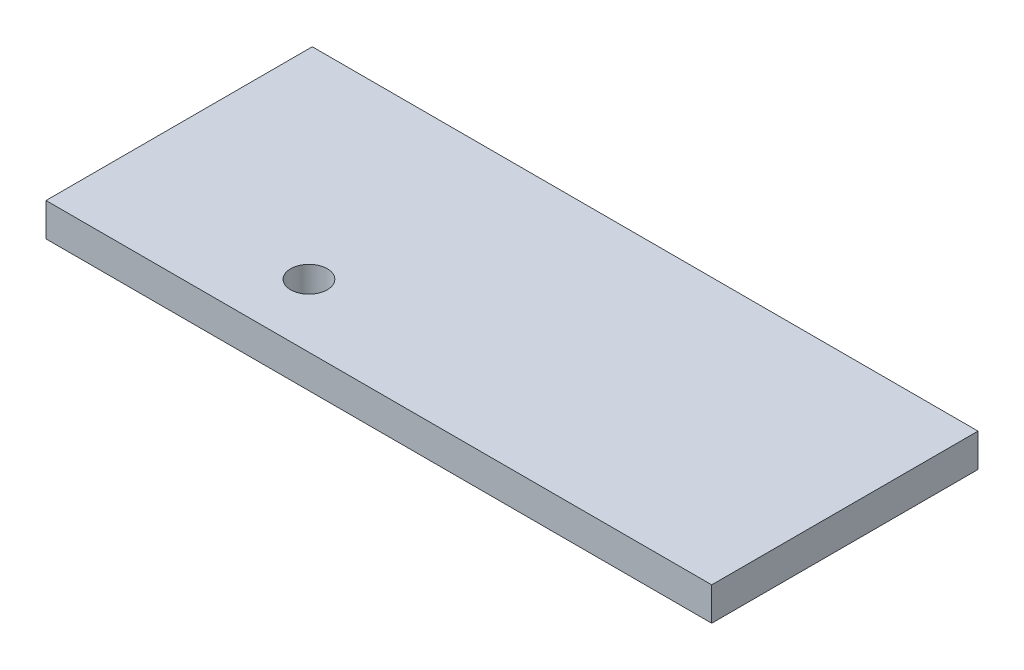
ISO-10303-21;
HEADER;
FILE_DESCRIPTION(('STEP AP214'),'2;1');
FILE_NAME('part.step','',(''),(''),'','','');
FILE_SCHEMA(('AUTOMOTIVE_DESIGN { 1 0 10303 214 1 1 1 1 }'));
ENDSEC;
DATA;
#1=APPLICATION_CONTEXT('core data for automotive mechanical design processes');
#2=APPLICATION_PROTOCOL_DEFINITION('international standard','automotive_design',2000,#1);
#3=PRODUCT_CONTEXT('',#1,'mechanical');
#4=PRODUCT('Part','Part','',(#3));
#5=PRODUCT_RELATED_PRODUCT_CATEGORY('part','',(#4));
#6=PRODUCT_DEFINITION_FORMATION('','',#4);
#7=PRODUCT_DEFINITION_CONTEXT('part definition',#1,'design');
#8=PRODUCT_DEFINITION('design','',#6,#7);
#9=PRODUCT_DEFINITION_SHAPE('','',#8);
#10=(LENGTH_UNIT() NAMED_UNIT(*) SI_UNIT(.MILLI.,.METRE.));
#11=(NAMED_UNIT(*) PLANE_ANGLE_UNIT() SI_UNIT($,.RADIAN.));
#12=(NAMED_UNIT(*) SI_UNIT($,.STERADIAN.) SOLID_ANGLE_UNIT());
#13=UNCERTAINTY_MEASURE_WITH_UNIT(LENGTH_MEASURE(1.E-05),#10,'distance_accuracy_value','');
#14=(GEOMETRIC_REPRESENTATION_CONTEXT(3) GLOBAL_UNCERTAINTY_ASSIGNED_CONTEXT((#13)) GLOBAL_UNIT_ASSIGNED_CONTEXT((#10,
#11,#12)) REPRESENTATION_CONTEXT('',''));
#15=CARTESIAN_POINT('',(0.,0.,0.));
#16=DIRECTION('',(0.,0.,1.));
#17=DIRECTION('',(1.,0.,0.));
#18=AXIS2_PLACEMENT_3D('',#15,#16,#17);
#19=CARTESIAN_POINT('',(0.,20.,0.));
#20=DIRECTION('',(0.,-1.,0.));
#21=DIRECTION('',(0.,0.,-1.));
#22=AXIS2_PLACEMENT_3D('',#19,#20,#21);
#23=PLANE('',#22);
#24=DIRECTION('',(0.,0.,1.));
#25=VECTOR('',#24,1.);
#26=CARTESIAN_POINT('',(0.,20.,0.));
#27=LINE('',#26,#25);
#28=CARTESIAN_POINT('',(0.,20.,-160.));
#29=VERTEX_POINT('',#28);
#30=CARTESIAN_POINT('',(0.,20.,0.));
#31=VERTEX_POINT('',#30);
#32=EDGE_CURVE('E98',#29,#31,#27,.T.);
#33=ORIENTED_EDGE('',*,*,#32,.T.);
#34=DIRECTION('',(1.,0.,0.));
#35=VECTOR('',#34,1.);
#36=CARTESIAN_POINT('',(0.,20.,0.));
#37=LINE('',#36,#35);
#38=CARTESIAN_POINT('',(400.,20.,0.));
#39=VERTEX_POINT('',#38);
#40=EDGE_CURVE('E93',#31,#39,#37,.T.);
#41=ORIENTED_EDGE('',*,*,#40,.T.);
#42=DIRECTION('',(0.,0.,-1.));
#43=VECTOR('',#42,1.);
#44=CARTESIAN_POINT('',(400.,20.,0.));
#45=LINE('',#44,#43);
#46=CARTESIAN_POINT('',(400.,20.,-160.));
#47=VERTEX_POINT('',#46);
#48=EDGE_CURVE('E96',#39,#47,#45,.T.);
#49=ORIENTED_EDGE('',*,*,#48,.T.);
#50=DIRECTION('',(-1.,0.,0.));
#51=VECTOR('',#50,1.);
#52=CARTESIAN_POINT('',(0.,20.,-160.));
#53=LINE('',#52,#51);
#54=EDGE_CURVE('E63',#47,#29,#53,.T.);
#55=ORIENTED_EDGE('',*,*,#54,.T.);
#56=EDGE_LOOP('',(#33,#41,#49,#55));
#57=FACE_BOUND('',#56,.T.);
#58=CARTESIAN_POINT('',(120.,20.,-38.));
#59=DIRECTION('',(0.,1.,0.));
#60=DIRECTION('',(0.,0.,1.));
#61=AXIS2_PLACEMENT_3D('',#58,#59,#60);
#62=CIRCLE('',#61,11.);
#63=CARTESIAN_POINT('',(120.,20.,-27.));
#64=VERTEX_POINT('',#63);
#65=EDGE_CURVE('E118',#64,#64,#62,.T.);
#66=ORIENTED_EDGE('',*,*,#65,.F.);
#67=EDGE_LOOP('',(#66));
#68=FACE_BOUND('',#67,.T.);
#69=ADVANCED_FACE('F45',(#57,#68),#23,.F.);
#70=CARTESIAN_POINT('',(0.,0.,0.));
#71=DIRECTION('',(0.,-1.,0.));
#72=DIRECTION('',(0.,0.,-1.));
#73=AXIS2_PLACEMENT_3D('',#70,#71,#72);
#74=PLANE('',#73);
#75=DIRECTION('',(0.,0.,1.));
#76=VECTOR('',#75,1.);
#77=CARTESIAN_POINT('',(0.,0.,0.));
#78=LINE('',#77,#76);
#79=CARTESIAN_POINT('',(0.,0.,-160.));
#80=VERTEX_POINT('',#79);
#81=CARTESIAN_POINT('',(0.,0.,0.));
#82=VERTEX_POINT('',#81);
#83=EDGE_CURVE('E114',#80,#82,#78,.T.);
#84=ORIENTED_EDGE('',*,*,#83,.F.);
#85=DIRECTION('',(-1.,0.,0.));
#86=VECTOR('',#85,1.);
#87=CARTESIAN_POINT('',(0.,0.,-160.));
#88=LINE('',#87,#86);
#89=CARTESIAN_POINT('',(400.,0.,-160.));
#90=VERTEX_POINT('',#89);
#91=EDGE_CURVE('E86',#90,#80,#88,.T.);
#92=ORIENTED_EDGE('',*,*,#91,.F.);
#93=DIRECTION('',(0.,0.,-1.));
#94=VECTOR('',#93,1.);
#95=CARTESIAN_POINT('',(400.,0.,0.));
#96=LINE('',#95,#94);
#97=CARTESIAN_POINT('',(400.,0.,0.));
#98=VERTEX_POINT('',#97);
#99=EDGE_CURVE('E80',#98,#90,#96,.T.);
#100=ORIENTED_EDGE('',*,*,#99,.F.);
#101=DIRECTION('',(1.,0.,0.));
#102=VECTOR('',#101,1.);
#103=CARTESIAN_POINT('',(0.,0.,0.));
#104=LINE('',#103,#102);
#105=EDGE_CURVE('E103',#82,#98,#104,.T.);
#106=ORIENTED_EDGE('',*,*,#105,.F.);
#107=EDGE_LOOP('',(#84,#92,#100,#106));
#108=FACE_BOUND('',#107,.T.);
#109=CARTESIAN_POINT('',(120.,0.,-38.));
#110=DIRECTION('',(0.,1.,0.));
#111=DIRECTION('',(0.,0.,1.));
#112=AXIS2_PLACEMENT_3D('',#109,#110,#111);
#113=CIRCLE('',#112,11.);
#114=CARTESIAN_POINT('',(120.,0.,-27.));
#115=VERTEX_POINT('',#114);
#116=EDGE_CURVE('E136',#115,#115,#113,.T.);
#117=ORIENTED_EDGE('',*,*,#116,.T.);
#118=EDGE_LOOP('',(#117));
#119=FACE_BOUND('',#118,.T.);
#120=ADVANCED_FACE('F131',(#108,#119),#74,.T.);
#121=CARTESIAN_POINT('',(0.,20.,0.));
#122=DIRECTION('',(1.,0.,0.));
#123=DIRECTION('',(0.,0.,-1.));
#124=AXIS2_PLACEMENT_3D('',#121,#122,#123);
#125=PLANE('',#124);
#126=ORIENTED_EDGE('',*,*,#83,.T.);
#127=DIRECTION('',(0.,-1.,0.));
#128=VECTOR('',#127,1.);
#129=CARTESIAN_POINT('',(0.,20.,0.));
#130=LINE('',#129,#128);
#131=EDGE_CURVE('E11',#31,#82,#130,.T.);
#132=ORIENTED_EDGE('',*,*,#131,.F.);
#133=ORIENTED_EDGE('',*,*,#32,.F.);
#134=DIRECTION('',(0.,-1.,0.));
#135=VECTOR('',#134,1.);
#136=CARTESIAN_POINT('',(0.,20.,-160.));
#137=LINE('',#136,#135);
#138=EDGE_CURVE('E110',#29,#80,#137,.T.);
#139=ORIENTED_EDGE('',*,*,#138,.T.);
#140=EDGE_LOOP('',(#126,#132,#133,#139));
#141=FACE_BOUND('',#140,.T.);
#142=ADVANCED_FACE('F47',(#141),#125,.F.);
#143=CARTESIAN_POINT('',(0.,20.,0.));
#144=DIRECTION('',(0.,0.,-1.));
#145=DIRECTION('',(-1.,0.,0.));
#146=AXIS2_PLACEMENT_3D('',#143,#144,#145);
#147=PLANE('',#146);
#148=ORIENTED_EDGE('',*,*,#105,.T.);
#149=DIRECTION('',(0.,-1.,0.));
#150=VECTOR('',#149,1.);
#151=CARTESIAN_POINT('',(400.,20.,0.));
#152=LINE('',#151,#150);
#153=EDGE_CURVE('E55',#39,#98,#152,.T.);
#154=ORIENTED_EDGE('',*,*,#153,.F.);
#155=ORIENTED_EDGE('',*,*,#40,.F.);
#156=ORIENTED_EDGE('',*,*,#131,.T.);
#157=EDGE_LOOP('',(#148,#154,#155,#156));
#158=FACE_BOUND('',#157,.T.);
#159=ADVANCED_FACE('F102',(#158),#147,.F.);
#160=CARTESIAN_POINT('',(400.,20.,0.));
#161=DIRECTION('',(-1.,0.,0.));
#162=DIRECTION('',(0.,0.,1.));
#163=AXIS2_PLACEMENT_3D('',#160,#161,#162);
#164=PLANE('',#163);
#165=ORIENTED_EDGE('',*,*,#99,.T.);
#166=DIRECTION('',(0.,-1.,0.));
#167=VECTOR('',#166,1.);
#168=CARTESIAN_POINT('',(400.,20.,-160.));
#169=LINE('',#168,#167);
#170=EDGE_CURVE('E105',#47,#90,#169,.T.);
#171=ORIENTED_EDGE('',*,*,#170,.F.);
#172=ORIENTED_EDGE('',*,*,#48,.F.);
#173=ORIENTED_EDGE('',*,*,#153,.T.);
#174=EDGE_LOOP('',(#165,#171,#172,#173));
#175=FACE_BOUND('',#174,.T.);
#176=ADVANCED_FACE('F106',(#175),#164,.F.);
#177=CARTESIAN_POINT('',(0.,20.,-160.));
#178=DIRECTION('',(0.,0.,1.));
#179=DIRECTION('',(1.,0.,0.));
#180=AXIS2_PLACEMENT_3D('',#177,#178,#179);
#181=PLANE('',#180);
#182=ORIENTED_EDGE('',*,*,#91,.T.);
#183=ORIENTED_EDGE('',*,*,#138,.F.);
#184=ORIENTED_EDGE('',*,*,#54,.F.);
#185=ORIENTED_EDGE('',*,*,#170,.T.);
#186=EDGE_LOOP('',(#182,#183,#184,#185));
#187=FACE_BOUND('',#186,.T.);
#188=ADVANCED_FACE('F128',(#187),#181,.F.);
#189=CARTESIAN_POINT('',(120.,20.,-38.));
#190=DIRECTION('',(0.,-1.,0.));
#191=DIRECTION('',(0.,0.,-1.));
#192=AXIS2_PLACEMENT_3D('',#189,#190,#191);
#193=CYLINDRICAL_SURFACE('',#192,11.);
#194=ORIENTED_EDGE('',*,*,#65,.T.);
#195=EDGE_LOOP('',(#194));
#196=FACE_BOUND('',#195,.T.);
#197=ORIENTED_EDGE('',*,*,#116,.F.);
#198=EDGE_LOOP('',(#197));
#199=FACE_BOUND('',#198,.T.);
#200=ADVANCED_FACE('F144',(#196,#199),#193,.F.);
#201=CLOSED_SHELL('',(#69,#120,#142,#159,#176,#188,#200));
#202=MANIFOLD_SOLID_BREP('B2',#201);
#203=ADVANCED_BREP_SHAPE_REPRESENTATION('',(#18,#202),#14);
#204=SHAPE_DEFINITION_REPRESENTATION(#9,#203);
ENDSEC;
END-ISO-10303-21;
